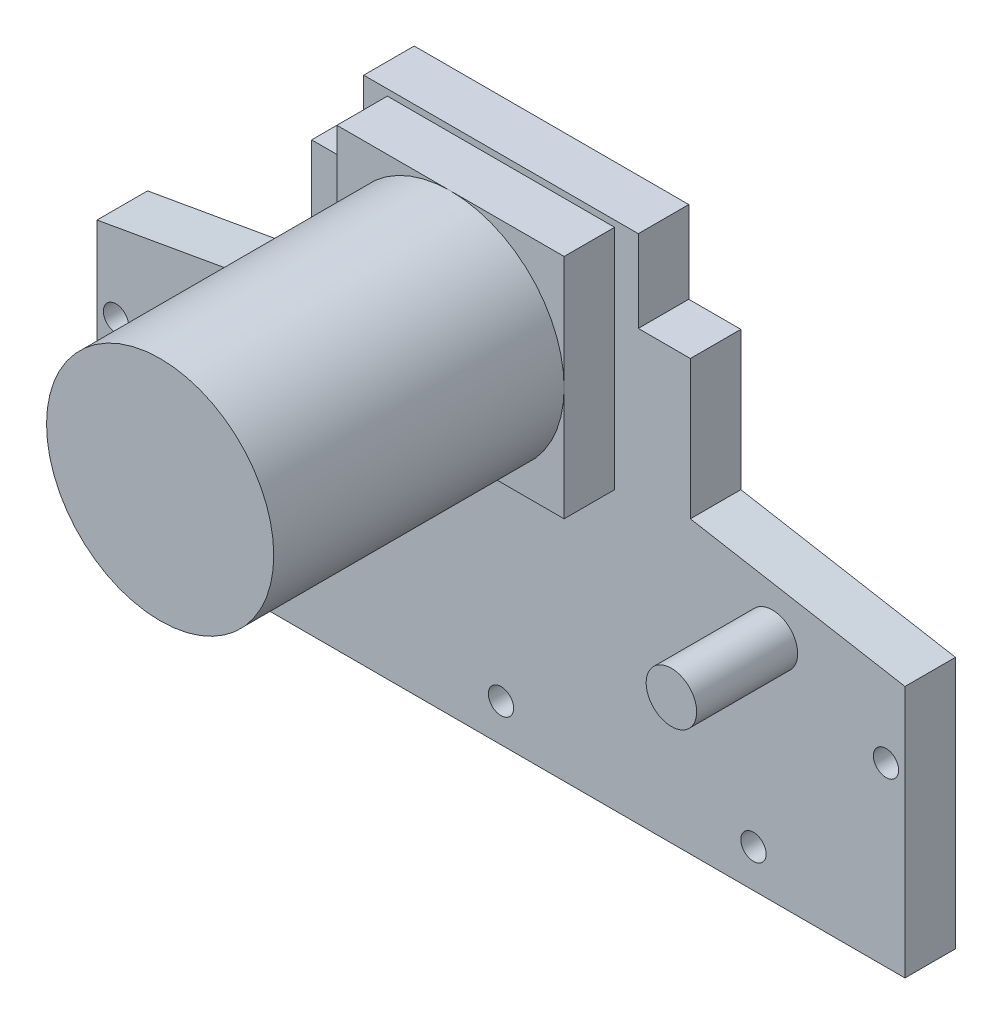
ISO-10303-21;
HEADER;
FILE_DESCRIPTION(('STEP AP214'),'2;1');
FILE_NAME('part.step','',(''),(''),'','','');
FILE_SCHEMA(('AUTOMOTIVE_DESIGN { 1 0 10303 214 1 1 1 1 }'));
ENDSEC;
DATA;
#1=APPLICATION_CONTEXT('core data for automotive mechanical design processes');
#2=APPLICATION_PROTOCOL_DEFINITION('international standard','automotive_design',2000,#1);
#3=PRODUCT_CONTEXT('',#1,'mechanical');
#4=PRODUCT('Part','Part','',(#3));
#5=PRODUCT_RELATED_PRODUCT_CATEGORY('part','',(#4));
#6=PRODUCT_DEFINITION_FORMATION('','',#4);
#7=PRODUCT_DEFINITION_CONTEXT('part definition',#1,'design');
#8=PRODUCT_DEFINITION('design','',#6,#7);
#9=PRODUCT_DEFINITION_SHAPE('','',#8);
#10=(LENGTH_UNIT() NAMED_UNIT(*) SI_UNIT(.MILLI.,.METRE.));
#11=(NAMED_UNIT(*) PLANE_ANGLE_UNIT() SI_UNIT($,.RADIAN.));
#12=(NAMED_UNIT(*) SI_UNIT($,.STERADIAN.) SOLID_ANGLE_UNIT());
#13=UNCERTAINTY_MEASURE_WITH_UNIT(LENGTH_MEASURE(1.E-05),#10,'distance_accuracy_value','');
#14=(GEOMETRIC_REPRESENTATION_CONTEXT(3) GLOBAL_UNCERTAINTY_ASSIGNED_CONTEXT((#13)) GLOBAL_UNIT_ASSIGNED_CONTEXT((#10,
#11,#12)) REPRESENTATION_CONTEXT('',''));
#15=CARTESIAN_POINT('',(0.,0.,0.));
#16=DIRECTION('',(0.,0.,1.));
#17=DIRECTION('',(1.,0.,0.));
#18=AXIS2_PLACEMENT_3D('',#15,#16,#17);
#19=CARTESIAN_POINT('',(0.,-43.1698837667497,4.));
#20=DIRECTION('',(0.,0.,1.));
#21=DIRECTION('',(1.,0.,0.));
#22=AXIS2_PLACEMENT_3D('',#19,#20,#21);
#23=PLANE('',#22);
#24=CARTESIAN_POINT('',(21.5,18.,4.));
#25=DIRECTION('',(0.,0.,1.));
#26=DIRECTION('',(1.,0.,0.));
#27=AXIS2_PLACEMENT_3D('',#24,#25,#26);
#28=CIRCLE('',#27,2.);
#29=CARTESIAN_POINT('',(23.5,18.,4.));
#30=VERTEX_POINT('',#29);
#31=EDGE_CURVE('E217',#30,#30,#28,.T.);
#32=ORIENTED_EDGE('',*,*,#31,.F.);
#33=EDGE_LOOP('',(#32));
#34=FACE_BOUND('',#33,.T.);
#35=CARTESIAN_POINT('',(30.5,14.,4.));
#36=DIRECTION('',(0.,0.,-1.));
#37=DIRECTION('',(-1.,0.,0.));
#38=AXIS2_PLACEMENT_3D('',#35,#36,#37);
#39=CIRCLE('',#38,1.);
#40=CARTESIAN_POINT('',(29.5,14.,4.));
#41=VERTEX_POINT('',#40);
#42=EDGE_CURVE('E260',#41,#41,#39,.T.);
#43=ORIENTED_EDGE('',*,*,#42,.T.);
#44=EDGE_LOOP('',(#43));
#45=FACE_BOUND('',#44,.T.);
#46=CARTESIAN_POINT('',(0.,3.,4.));
#47=DIRECTION('',(0.,0.,1.));
#48=DIRECTION('',(1.,0.,0.));
#49=AXIS2_PLACEMENT_3D('',#46,#47,#48);
#50=CIRCLE('',#49,1.);
#51=CARTESIAN_POINT('',(1.,3.,4.));
#52=VERTEX_POINT('',#51);
#53=EDGE_CURVE('E264',#52,#52,#50,.T.);
#54=ORIENTED_EDGE('',*,*,#53,.F.);
#55=EDGE_LOOP('',(#54));
#56=FACE_BOUND('',#55,.T.);
#57=CARTESIAN_POINT('',(-20.,3.,4.));
#58=DIRECTION('',(0.,0.,1.));
#59=DIRECTION('',(1.,0.,0.));
#60=AXIS2_PLACEMENT_3D('',#57,#58,#59);
#61=CIRCLE('',#60,1.);
#62=CARTESIAN_POINT('',(-19.,3.,4.));
#63=VERTEX_POINT('',#62);
#64=EDGE_CURVE('E268',#63,#63,#61,.T.);
#65=ORIENTED_EDGE('',*,*,#64,.F.);
#66=EDGE_LOOP('',(#65));
#67=FACE_BOUND('',#66,.T.);
#68=CARTESIAN_POINT('',(20.,3.,4.));
#69=DIRECTION('',(0.,0.,1.));
#70=DIRECTION('',(1.,0.,0.));
#71=AXIS2_PLACEMENT_3D('',#68,#69,#70);
#72=CIRCLE('',#71,1.);
#73=CARTESIAN_POINT('',(21.,3.,4.));
#74=VERTEX_POINT('',#73);
#75=EDGE_CURVE('E272',#74,#74,#72,.T.);
#76=ORIENTED_EDGE('',*,*,#75,.F.);
#77=EDGE_LOOP('',(#76));
#78=FACE_BOUND('',#77,.T.);
#79=CARTESIAN_POINT('',(-30.5,14.,4.));
#80=DIRECTION('',(0.,0.,1.));
#81=DIRECTION('',(1.,0.,0.));
#82=AXIS2_PLACEMENT_3D('',#79,#80,#81);
#83=CIRCLE('',#82,1.);
#84=CARTESIAN_POINT('',(-29.5,14.,4.));
#85=VERTEX_POINT('',#84);
#86=EDGE_CURVE('E276',#85,#85,#83,.T.);
#87=ORIENTED_EDGE('',*,*,#86,.F.);
#88=EDGE_LOOP('',(#87));
#89=FACE_BOUND('',#88,.T.);
#90=DIRECTION('',(0.,1.,0.));
#91=VECTOR('',#90,1.);
#92=CARTESIAN_POINT('',(32.,-43.1698837667497,4.));
#93=LINE('',#92,#91);
#94=CARTESIAN_POINT('',(32.,0.,4.));
#95=VERTEX_POINT('',#94);
#96=CARTESIAN_POINT('',(32.,20.,4.));
#97=VERTEX_POINT('',#96);
#98=EDGE_CURVE('E280',#95,#97,#93,.T.);
#99=ORIENTED_EDGE('',*,*,#98,.T.);
#100=DIRECTION('',(-0.984783558817937,0.173785333909048,0.));
#101=VECTOR('',#100,1.);
#102=CARTESIAN_POINT('',(11.7773962151149,23.568694785568,4.));
#103=LINE('',#102,#101);
#104=CARTESIAN_POINT('',(15.,23.,4.));
#105=VERTEX_POINT('',#104);
#106=EDGE_CURVE('E283',#97,#105,#103,.T.);
#107=ORIENTED_EDGE('',*,*,#106,.T.);
#108=DIRECTION('',(0.,-1.,0.));
#109=VECTOR('',#108,1.);
#110=CARTESIAN_POINT('',(15.,-43.1698837667497,4.));
#111=LINE('',#110,#109);
#112=CARTESIAN_POINT('',(15.,34.,4.));
#113=VERTEX_POINT('',#112);
#114=EDGE_CURVE('E286',#113,#105,#111,.T.);
#115=ORIENTED_EDGE('',*,*,#114,.F.);
#116=DIRECTION('',(1.,0.,0.));
#117=VECTOR('',#116,1.);
#118=CARTESIAN_POINT('',(0.,34.,4.));
#119=LINE('',#118,#117);
#120=CARTESIAN_POINT('',(10.875,34.,4.));
#121=VERTEX_POINT('',#120);
#122=EDGE_CURVE('E289',#121,#113,#119,.T.);
#123=ORIENTED_EDGE('',*,*,#122,.F.);
#124=DIRECTION('',(0.,-1.,0.));
#125=VECTOR('',#124,1.);
#126=CARTESIAN_POINT('',(10.875,-43.1698837667497,4.));
#127=LINE('',#126,#125);
#128=CARTESIAN_POINT('',(10.875,40.5,4.));
#129=VERTEX_POINT('',#128);
#130=EDGE_CURVE('E292',#129,#121,#127,.T.);
#131=ORIENTED_EDGE('',*,*,#130,.F.);
#132=DIRECTION('',(1.,0.,0.));
#133=VECTOR('',#132,1.);
#134=CARTESIAN_POINT('',(0.,40.5,4.));
#135=LINE('',#134,#133);
#136=CARTESIAN_POINT('',(-10.875,40.5,4.));
#137=VERTEX_POINT('',#136);
#138=EDGE_CURVE('E296',#137,#129,#135,.T.);
#139=ORIENTED_EDGE('',*,*,#138,.F.);
#140=DIRECTION('',(0.,-1.,0.));
#141=VECTOR('',#140,1.);
#142=CARTESIAN_POINT('',(-10.875,-43.1698837667497,4.));
#143=LINE('',#142,#141);
#144=CARTESIAN_POINT('',(-10.875,34.,4.));
#145=VERTEX_POINT('',#144);
#146=EDGE_CURVE('E299',#137,#145,#143,.T.);
#147=ORIENTED_EDGE('',*,*,#146,.T.);
#148=CARTESIAN_POINT('',(-15.,34.,4.));
#149=VERTEX_POINT('',#148);
#150=EDGE_CURVE('E293',#149,#145,#119,.T.);
#151=ORIENTED_EDGE('',*,*,#150,.F.);
#152=DIRECTION('',(0.,1.,0.));
#153=VECTOR('',#152,1.);
#154=CARTESIAN_POINT('',(-15.,-43.1698837667497,4.));
#155=LINE('',#154,#153);
#156=CARTESIAN_POINT('',(-15.,23.,4.));
#157=VERTEX_POINT('',#156);
#158=EDGE_CURVE('E301',#157,#149,#155,.T.);
#159=ORIENTED_EDGE('',*,*,#158,.F.);
#160=DIRECTION('',(0.984783558817937,0.173785333909048,0.));
#161=VECTOR('',#160,1.);
#162=CARTESIAN_POINT('',(-11.7773962151149,23.568694785568,4.));
#163=LINE('',#162,#161);
#164=CARTESIAN_POINT('',(-32.,20.,4.));
#165=VERTEX_POINT('',#164);
#166=EDGE_CURVE('E304',#165,#157,#163,.T.);
#167=ORIENTED_EDGE('',*,*,#166,.F.);
#168=DIRECTION('',(0.,1.,0.));
#169=VECTOR('',#168,1.);
#170=CARTESIAN_POINT('',(-32.,-43.1698837667497,4.));
#171=LINE('',#170,#169);
#172=CARTESIAN_POINT('',(-32.,0.,4.));
#173=VERTEX_POINT('',#172);
#174=EDGE_CURVE('E307',#173,#165,#171,.T.);
#175=ORIENTED_EDGE('',*,*,#174,.F.);
#176=DIRECTION('',(1.,0.,0.));
#177=VECTOR('',#176,1.);
#178=CARTESIAN_POINT('',(0.,0.,4.));
#179=LINE('',#178,#177);
#180=EDGE_CURVE('E310',#173,#95,#179,.T.);
#181=ORIENTED_EDGE('',*,*,#180,.T.);
#182=EDGE_LOOP('',(#99,#107,#115,#123,#131,#139,#147,#151,#159,#167,#175,#181));
#183=FACE_BOUND('',#182,.T.);
#184=CARTESIAN_POINT('',(-21.5,18.,4.));
#185=DIRECTION('',(0.,0.,1.));
#186=DIRECTION('',(1.,0.,0.));
#187=AXIS2_PLACEMENT_3D('',#184,#185,#186);
#188=CIRCLE('',#187,2.);
#189=CARTESIAN_POINT('',(-19.5,18.,4.));
#190=VERTEX_POINT('',#189);
#191=EDGE_CURVE('E205',#190,#190,#188,.T.);
#192=ORIENTED_EDGE('',*,*,#191,.F.);
#193=EDGE_LOOP('',(#192));
#194=FACE_BOUND('',#193,.T.);
#195=DIRECTION('',(0.,-1.,0.));
#196=VECTOR('',#195,1.);
#197=CARTESIAN_POINT('',(-8.99999999999974,40.0000000000001,4.));
#198=LINE('',#197,#196);
#199=CARTESIAN_POINT('',(-8.99999999999974,40.0000000000001,4.));
#200=VERTEX_POINT('',#199);
#201=CARTESIAN_POINT('',(-8.99999999999974,22.0000000000001,4.));
#202=VERTEX_POINT('',#201);
#203=EDGE_CURVE('E771',#200,#202,#198,.T.);
#204=ORIENTED_EDGE('',*,*,#203,.F.);
#205=DIRECTION('',(-1.,0.,0.));
#206=VECTOR('',#205,1.);
#207=CARTESIAN_POINT('',(-8.99999999999974,40.0000000000001,4.));
#208=LINE('',#207,#206);
#209=CARTESIAN_POINT('',(9.00000000000026,40.0000000000001,4.));
#210=VERTEX_POINT('',#209);
#211=EDGE_CURVE('E769',#210,#200,#208,.T.);
#212=ORIENTED_EDGE('',*,*,#211,.F.);
#213=DIRECTION('',(0.,1.,0.));
#214=VECTOR('',#213,1.);
#215=CARTESIAN_POINT('',(9.00000000000026,40.0000000000001,4.));
#216=LINE('',#215,#214);
#217=CARTESIAN_POINT('',(9.00000000000026,22.0000000000001,4.));
#218=VERTEX_POINT('',#217);
#219=EDGE_CURVE('E204',#218,#210,#216,.T.);
#220=ORIENTED_EDGE('',*,*,#219,.F.);
#221=DIRECTION('',(1.,0.,0.));
#222=VECTOR('',#221,1.);
#223=CARTESIAN_POINT('',(-8.99999999999974,22.0000000000001,4.));
#224=LINE('',#223,#222);
#225=EDGE_CURVE('E49',#202,#218,#224,.T.);
#226=ORIENTED_EDGE('',*,*,#225,.F.);
#227=EDGE_LOOP('',(#204,#212,#220,#226));
#228=FACE_BOUND('',#227,.T.);
#229=ADVANCED_FACE('F33',(#34,#45,#56,#67,#78,#89,#183,#194,#228),#23,.T.);
#230=CARTESIAN_POINT('',(0.,-43.1698837667497,0.));
#231=DIRECTION('',(0.,0.,1.));
#232=DIRECTION('',(1.,0.,0.));
#233=AXIS2_PLACEMENT_3D('',#230,#231,#232);
#234=PLANE('',#233);
#235=CARTESIAN_POINT('',(30.5,14.,0.));
#236=DIRECTION('',(0.,0.,1.));
#237=DIRECTION('',(1.,0.,0.));
#238=AXIS2_PLACEMENT_3D('',#235,#236,#237);
#239=CIRCLE('',#238,1.);
#240=CARTESIAN_POINT('',(31.5,14.,0.));
#241=VERTEX_POINT('',#240);
#242=EDGE_CURVE('E263',#241,#241,#239,.F.);
#243=ORIENTED_EDGE('',*,*,#242,.F.);
#244=EDGE_LOOP('',(#243));
#245=FACE_BOUND('',#244,.T.);
#246=CARTESIAN_POINT('',(0.,3.,0.));
#247=DIRECTION('',(0.,0.,1.));
#248=DIRECTION('',(1.,0.,0.));
#249=AXIS2_PLACEMENT_3D('',#246,#247,#248);
#250=CIRCLE('',#249,1.);
#251=CARTESIAN_POINT('',(1.,3.,0.));
#252=VERTEX_POINT('',#251);
#253=EDGE_CURVE('E267',#252,#252,#250,.T.);
#254=ORIENTED_EDGE('',*,*,#253,.T.);
#255=EDGE_LOOP('',(#254));
#256=FACE_BOUND('',#255,.T.);
#257=CARTESIAN_POINT('',(-20.,3.,0.));
#258=DIRECTION('',(0.,0.,1.));
#259=DIRECTION('',(1.,0.,0.));
#260=AXIS2_PLACEMENT_3D('',#257,#258,#259);
#261=CIRCLE('',#260,1.);
#262=CARTESIAN_POINT('',(-19.,3.,0.));
#263=VERTEX_POINT('',#262);
#264=EDGE_CURVE('E271',#263,#263,#261,.T.);
#265=ORIENTED_EDGE('',*,*,#264,.T.);
#266=EDGE_LOOP('',(#265));
#267=FACE_BOUND('',#266,.T.);
#268=CARTESIAN_POINT('',(20.,3.,0.));
#269=DIRECTION('',(0.,0.,1.));
#270=DIRECTION('',(1.,0.,0.));
#271=AXIS2_PLACEMENT_3D('',#268,#269,#270);
#272=CIRCLE('',#271,1.);
#273=CARTESIAN_POINT('',(21.,3.,0.));
#274=VERTEX_POINT('',#273);
#275=EDGE_CURVE('E275',#274,#274,#272,.T.);
#276=ORIENTED_EDGE('',*,*,#275,.T.);
#277=EDGE_LOOP('',(#276));
#278=FACE_BOUND('',#277,.T.);
#279=CARTESIAN_POINT('',(-30.5,14.,0.));
#280=DIRECTION('',(0.,0.,1.));
#281=DIRECTION('',(1.,0.,0.));
#282=AXIS2_PLACEMENT_3D('',#279,#280,#281);
#283=CIRCLE('',#282,1.);
#284=CARTESIAN_POINT('',(-29.5,14.,0.));
#285=VERTEX_POINT('',#284);
#286=EDGE_CURVE('E279',#285,#285,#283,.T.);
#287=ORIENTED_EDGE('',*,*,#286,.T.);
#288=EDGE_LOOP('',(#287));
#289=FACE_BOUND('',#288,.T.);
#290=DIRECTION('',(0.,1.,0.));
#291=VECTOR('',#290,1.);
#292=CARTESIAN_POINT('',(32.,-43.1698837667497,0.));
#293=LINE('',#292,#291);
#294=CARTESIAN_POINT('',(32.,0.,0.));
#295=VERTEX_POINT('',#294);
#296=CARTESIAN_POINT('',(32.,20.,0.));
#297=VERTEX_POINT('',#296);
#298=EDGE_CURVE('E313',#295,#297,#293,.T.);
#299=ORIENTED_EDGE('',*,*,#298,.F.);
#300=DIRECTION('',(1.,0.,0.));
#301=VECTOR('',#300,1.);
#302=CARTESIAN_POINT('',(0.,0.,0.));
#303=LINE('',#302,#301);
#304=CARTESIAN_POINT('',(-32.,0.,0.));
#305=VERTEX_POINT('',#304);
#306=EDGE_CURVE('E284',#305,#295,#303,.T.);
#307=ORIENTED_EDGE('',*,*,#306,.F.);
#308=DIRECTION('',(0.,1.,0.));
#309=VECTOR('',#308,1.);
#310=CARTESIAN_POINT('',(-32.,-43.1698837667497,0.));
#311=LINE('',#310,#309);
#312=CARTESIAN_POINT('',(-32.,20.,0.));
#313=VERTEX_POINT('',#312);
#314=EDGE_CURVE('E341',#305,#313,#311,.T.);
#315=ORIENTED_EDGE('',*,*,#314,.T.);
#316=DIRECTION('',(0.984783558817937,0.173785333909048,0.));
#317=VECTOR('',#316,1.);
#318=CARTESIAN_POINT('',(-11.7773962151149,23.568694785568,0.));
#319=LINE('',#318,#317);
#320=CARTESIAN_POINT('',(-15.,23.,0.));
#321=VERTEX_POINT('',#320);
#322=EDGE_CURVE('E338',#313,#321,#319,.T.);
#323=ORIENTED_EDGE('',*,*,#322,.T.);
#324=DIRECTION('',(0.,1.,0.));
#325=VECTOR('',#324,1.);
#326=CARTESIAN_POINT('',(-15.,-43.1698837667497,0.));
#327=LINE('',#326,#325);
#328=CARTESIAN_POINT('',(-15.,34.,0.));
#329=VERTEX_POINT('',#328);
#330=EDGE_CURVE('E335',#321,#329,#327,.T.);
#331=ORIENTED_EDGE('',*,*,#330,.T.);
#332=DIRECTION('',(1.,0.,0.));
#333=VECTOR('',#332,1.);
#334=CARTESIAN_POINT('',(0.,34.,0.));
#335=LINE('',#334,#333);
#336=CARTESIAN_POINT('',(-10.875,34.,0.));
#337=VERTEX_POINT('',#336);
#338=EDGE_CURVE('E326',#329,#337,#335,.T.);
#339=ORIENTED_EDGE('',*,*,#338,.T.);
#340=DIRECTION('',(0.,-1.,0.));
#341=VECTOR('',#340,1.);
#342=CARTESIAN_POINT('',(-10.875,-43.1698837667497,0.));
#343=LINE('',#342,#341);
#344=CARTESIAN_POINT('',(-10.875,40.5,0.));
#345=VERTEX_POINT('',#344);
#346=EDGE_CURVE('E332',#345,#337,#343,.T.);
#347=ORIENTED_EDGE('',*,*,#346,.F.);
#348=DIRECTION('',(1.,0.,0.));
#349=VECTOR('',#348,1.);
#350=CARTESIAN_POINT('',(0.,40.5,0.));
#351=LINE('',#350,#349);
#352=CARTESIAN_POINT('',(10.875,40.5,0.));
#353=VERTEX_POINT('',#352);
#354=EDGE_CURVE('E329',#345,#353,#351,.T.);
#355=ORIENTED_EDGE('',*,*,#354,.T.);
#356=DIRECTION('',(0.,-1.,0.));
#357=VECTOR('',#356,1.);
#358=CARTESIAN_POINT('',(10.875,-43.1698837667497,0.));
#359=LINE('',#358,#357);
#360=CARTESIAN_POINT('',(10.875,34.,0.));
#361=VERTEX_POINT('',#360);
#362=EDGE_CURVE('E325',#353,#361,#359,.T.);
#363=ORIENTED_EDGE('',*,*,#362,.T.);
#364=CARTESIAN_POINT('',(15.,34.,0.));
#365=VERTEX_POINT('',#364);
#366=EDGE_CURVE('E322',#361,#365,#335,.T.);
#367=ORIENTED_EDGE('',*,*,#366,.T.);
#368=DIRECTION('',(0.,-1.,0.));
#369=VECTOR('',#368,1.);
#370=CARTESIAN_POINT('',(15.,-43.1698837667497,0.));
#371=LINE('',#370,#369);
#372=CARTESIAN_POINT('',(15.,23.,0.));
#373=VERTEX_POINT('',#372);
#374=EDGE_CURVE('E319',#365,#373,#371,.T.);
#375=ORIENTED_EDGE('',*,*,#374,.T.);
#376=DIRECTION('',(-0.984783558817937,0.173785333909048,0.));
#377=VECTOR('',#376,1.);
#378=CARTESIAN_POINT('',(11.7773962151149,23.568694785568,0.));
#379=LINE('',#378,#377);
#380=EDGE_CURVE('E316',#297,#373,#379,.T.);
#381=ORIENTED_EDGE('',*,*,#380,.F.);
#382=EDGE_LOOP('',(#299,#307,#315,#323,#331,#339,#347,#355,#363,#367,#375,#381));
#383=FACE_BOUND('',#382,.T.);
#384=DIRECTION('',(0.,-1.,0.));
#385=VECTOR('',#384,1.);
#386=CARTESIAN_POINT('',(5.,10.,0.));
#387=LINE('',#386,#385);
#388=CARTESIAN_POINT('',(5.,28.,0.));
#389=VERTEX_POINT('',#388);
#390=CARTESIAN_POINT('',(5.,10.,0.));
#391=VERTEX_POINT('',#390);
#392=EDGE_CURVE('E222',#389,#391,#387,.T.);
#393=ORIENTED_EDGE('',*,*,#392,.F.);
#394=DIRECTION('',(1.,0.,0.));
#395=VECTOR('',#394,1.);
#396=CARTESIAN_POINT('',(5.,28.,0.));
#397=LINE('',#396,#395);
#398=CARTESIAN_POINT('',(-13.,28.,0.));
#399=VERTEX_POINT('',#398);
#400=EDGE_CURVE('E229',#399,#389,#397,.T.);
#401=ORIENTED_EDGE('',*,*,#400,.F.);
#402=DIRECTION('',(0.,1.,0.));
#403=VECTOR('',#402,1.);
#404=CARTESIAN_POINT('',(-13.,10.,0.));
#405=LINE('',#404,#403);
#406=CARTESIAN_POINT('',(-13.,10.,0.));
#407=VERTEX_POINT('',#406);
#408=EDGE_CURVE('E241',#407,#399,#405,.T.);
#409=ORIENTED_EDGE('',*,*,#408,.F.);
#410=DIRECTION('',(-1.,0.,0.));
#411=VECTOR('',#410,1.);
#412=CARTESIAN_POINT('',(5.,10.,0.));
#413=LINE('',#412,#411);
#414=EDGE_CURVE('E238',#391,#407,#413,.T.);
#415=ORIENTED_EDGE('',*,*,#414,.F.);
#416=EDGE_LOOP('',(#393,#401,#409,#415));
#417=FACE_BOUND('',#416,.T.);
#418=ADVANCED_FACE('F382',(#245,#256,#267,#278,#289,#383,#417),#234,.F.);
#419=CARTESIAN_POINT('',(32.,-43.1698837667497,4.));
#420=DIRECTION('',(-1.,0.,0.));
#421=DIRECTION('',(0.,0.,1.));
#422=AXIS2_PLACEMENT_3D('',#419,#420,#421);
#423=PLANE('',#422);
#424=ORIENTED_EDGE('',*,*,#298,.T.);
#425=DIRECTION('',(0.,0.,-1.));
#426=VECTOR('',#425,1.);
#427=CARTESIAN_POINT('',(32.,20.,4.));
#428=LINE('',#427,#426);
#429=EDGE_CURVE('E367',#97,#297,#428,.T.);
#430=ORIENTED_EDGE('',*,*,#429,.F.);
#431=ORIENTED_EDGE('',*,*,#98,.F.);
#432=DIRECTION('',(0.,0.,-1.));
#433=VECTOR('',#432,1.);
#434=CARTESIAN_POINT('',(32.,0.,4.));
#435=LINE('',#434,#433);
#436=EDGE_CURVE('E312',#95,#295,#435,.T.);
#437=ORIENTED_EDGE('',*,*,#436,.T.);
#438=EDGE_LOOP('',(#424,#430,#431,#437));
#439=FACE_BOUND('',#438,.T.);
#440=ADVANCED_FACE('F35',(#439),#423,.F.);
#441=CARTESIAN_POINT('',(11.7773962151149,23.568694785568,4.));
#442=DIRECTION('',(-0.173785333909048,-0.984783558817937,0.));
#443=DIRECTION('',(0.984783558817937,-0.173785333909048,0.));
#444=AXIS2_PLACEMENT_3D('',#441,#442,#443);
#445=PLANE('',#444);
#446=ORIENTED_EDGE('',*,*,#380,.T.);
#447=DIRECTION('',(0.,0.,-1.));
#448=VECTOR('',#447,1.);
#449=CARTESIAN_POINT('',(15.,23.,4.));
#450=LINE('',#449,#448);
#451=EDGE_CURVE('E365',#105,#373,#450,.T.);
#452=ORIENTED_EDGE('',*,*,#451,.F.);
#453=ORIENTED_EDGE('',*,*,#106,.F.);
#454=ORIENTED_EDGE('',*,*,#429,.T.);
#455=EDGE_LOOP('',(#446,#452,#453,#454));
#456=FACE_BOUND('',#455,.T.);
#457=ADVANCED_FACE('F470',(#456),#445,.F.);
#458=CARTESIAN_POINT('',(15.,-43.1698837667497,4.));
#459=DIRECTION('',(1.,0.,0.));
#460=DIRECTION('',(0.,0.,-1.));
#461=AXIS2_PLACEMENT_3D('',#458,#459,#460);
#462=PLANE('',#461);
#463=ORIENTED_EDGE('',*,*,#374,.F.);
#464=DIRECTION('',(0.,0.,-1.));
#465=VECTOR('',#464,1.);
#466=CARTESIAN_POINT('',(15.,34.,4.));
#467=LINE('',#466,#465);
#468=EDGE_CURVE('E363',#113,#365,#467,.T.);
#469=ORIENTED_EDGE('',*,*,#468,.F.);
#470=ORIENTED_EDGE('',*,*,#114,.T.);
#471=ORIENTED_EDGE('',*,*,#451,.T.);
#472=EDGE_LOOP('',(#463,#469,#470,#471));
#473=FACE_BOUND('',#472,.T.);
#474=ADVANCED_FACE('F468',(#473),#462,.T.);
#475=CARTESIAN_POINT('',(0.,34.,4.));
#476=DIRECTION('',(0.,1.,0.));
#477=DIRECTION('',(0.,0.,1.));
#478=AXIS2_PLACEMENT_3D('',#475,#476,#477);
#479=PLANE('',#478);
#480=ORIENTED_EDGE('',*,*,#366,.F.);
#481=DIRECTION('',(0.,0.,-1.));
#482=VECTOR('',#481,1.);
#483=CARTESIAN_POINT('',(10.875,34.,4.));
#484=LINE('',#483,#482);
#485=EDGE_CURVE('E361',#121,#361,#484,.T.);
#486=ORIENTED_EDGE('',*,*,#485,.F.);
#487=ORIENTED_EDGE('',*,*,#122,.T.);
#488=ORIENTED_EDGE('',*,*,#468,.T.);
#489=EDGE_LOOP('',(#480,#486,#487,#488));
#490=FACE_BOUND('',#489,.T.);
#491=ADVANCED_FACE('F456',(#490),#479,.T.);
#492=CARTESIAN_POINT('',(10.875,-43.1698837667497,4.));
#493=DIRECTION('',(1.,0.,0.));
#494=DIRECTION('',(0.,0.,-1.));
#495=AXIS2_PLACEMENT_3D('',#492,#493,#494);
#496=PLANE('',#495);
#497=ORIENTED_EDGE('',*,*,#362,.F.);
#498=DIRECTION('',(0.,0.,-1.));
#499=VECTOR('',#498,1.);
#500=CARTESIAN_POINT('',(10.875,40.5,4.));
#501=LINE('',#500,#499);
#502=EDGE_CURVE('E359',#129,#353,#501,.T.);
#503=ORIENTED_EDGE('',*,*,#502,.F.);
#504=ORIENTED_EDGE('',*,*,#130,.T.);
#505=ORIENTED_EDGE('',*,*,#485,.T.);
#506=EDGE_LOOP('',(#497,#503,#504,#505));
#507=FACE_BOUND('',#506,.T.);
#508=ADVANCED_FACE('F463',(#507),#496,.T.);
#509=CARTESIAN_POINT('',(0.,40.5,4.));
#510=DIRECTION('',(0.,1.,0.));
#511=DIRECTION('',(0.,0.,1.));
#512=AXIS2_PLACEMENT_3D('',#509,#510,#511);
#513=PLANE('',#512);
#514=ORIENTED_EDGE('',*,*,#354,.F.);
#515=DIRECTION('',(0.,0.,-1.));
#516=VECTOR('',#515,1.);
#517=CARTESIAN_POINT('',(-10.875,40.5,4.));
#518=LINE('',#517,#516);
#519=EDGE_CURVE('E357',#137,#345,#518,.T.);
#520=ORIENTED_EDGE('',*,*,#519,.F.);
#521=ORIENTED_EDGE('',*,*,#138,.T.);
#522=ORIENTED_EDGE('',*,*,#502,.T.);
#523=EDGE_LOOP('',(#514,#520,#521,#522));
#524=FACE_BOUND('',#523,.T.);
#525=ADVANCED_FACE('F459',(#524),#513,.T.);
#526=CARTESIAN_POINT('',(-10.875,-43.1698837667497,4.));
#527=DIRECTION('',(1.,0.,0.));
#528=DIRECTION('',(0.,0.,-1.));
#529=AXIS2_PLACEMENT_3D('',#526,#527,#528);
#530=PLANE('',#529);
#531=ORIENTED_EDGE('',*,*,#346,.T.);
#532=DIRECTION('',(0.,0.,-1.));
#533=VECTOR('',#532,1.);
#534=CARTESIAN_POINT('',(-10.875,34.,4.));
#535=LINE('',#534,#533);
#536=EDGE_CURVE('E355',#145,#337,#535,.T.);
#537=ORIENTED_EDGE('',*,*,#536,.F.);
#538=ORIENTED_EDGE('',*,*,#146,.F.);
#539=ORIENTED_EDGE('',*,*,#519,.T.);
#540=EDGE_LOOP('',(#531,#537,#538,#539));
#541=FACE_BOUND('',#540,.T.);
#542=ADVANCED_FACE('F454',(#541),#530,.F.);
#543=ORIENTED_EDGE('',*,*,#338,.F.);
#544=DIRECTION('',(0.,0.,-1.));
#545=VECTOR('',#544,1.);
#546=CARTESIAN_POINT('',(-15.,34.,4.));
#547=LINE('',#546,#545);
#548=EDGE_CURVE('E353',#149,#329,#547,.T.);
#549=ORIENTED_EDGE('',*,*,#548,.F.);
#550=ORIENTED_EDGE('',*,*,#150,.T.);
#551=ORIENTED_EDGE('',*,*,#536,.T.);
#552=EDGE_LOOP('',(#543,#549,#550,#551));
#553=FACE_BOUND('',#552,.T.);
#554=ADVANCED_FACE('F450',(#553),#479,.T.);
#555=CARTESIAN_POINT('',(-15.,-43.1698837667497,4.));
#556=DIRECTION('',(-1.,0.,0.));
#557=DIRECTION('',(0.,0.,1.));
#558=AXIS2_PLACEMENT_3D('',#555,#556,#557);
#559=PLANE('',#558);
#560=ORIENTED_EDGE('',*,*,#330,.F.);
#561=DIRECTION('',(0.,0.,-1.));
#562=VECTOR('',#561,1.);
#563=CARTESIAN_POINT('',(-15.,23.,4.));
#564=LINE('',#563,#562);
#565=EDGE_CURVE('E351',#157,#321,#564,.T.);
#566=ORIENTED_EDGE('',*,*,#565,.F.);
#567=ORIENTED_EDGE('',*,*,#158,.T.);
#568=ORIENTED_EDGE('',*,*,#548,.T.);
#569=EDGE_LOOP('',(#560,#566,#567,#568));
#570=FACE_BOUND('',#569,.T.);
#571=ADVANCED_FACE('F446',(#570),#559,.T.);
#572=CARTESIAN_POINT('',(-11.7773962151149,23.568694785568,4.));
#573=DIRECTION('',(-0.173785333909048,0.984783558817937,0.));
#574=DIRECTION('',(-0.984783558817937,-0.173785333909048,0.));
#575=AXIS2_PLACEMENT_3D('',#572,#573,#574);
#576=PLANE('',#575);
#577=ORIENTED_EDGE('',*,*,#322,.F.);
#578=DIRECTION('',(0.,0.,-1.));
#579=VECTOR('',#578,1.);
#580=CARTESIAN_POINT('',(-32.,20.,4.));
#581=LINE('',#580,#579);
#582=EDGE_CURVE('E349',#165,#313,#581,.T.);
#583=ORIENTED_EDGE('',*,*,#582,.F.);
#584=ORIENTED_EDGE('',*,*,#166,.T.);
#585=ORIENTED_EDGE('',*,*,#565,.T.);
#586=EDGE_LOOP('',(#577,#583,#584,#585));
#587=FACE_BOUND('',#586,.T.);
#588=ADVANCED_FACE('F442',(#587),#576,.T.);
#589=CARTESIAN_POINT('',(-32.,-43.1698837667497,4.));
#590=DIRECTION('',(-1.,0.,0.));
#591=DIRECTION('',(0.,0.,1.));
#592=AXIS2_PLACEMENT_3D('',#589,#590,#591);
#593=PLANE('',#592);
#594=ORIENTED_EDGE('',*,*,#314,.F.);
#595=DIRECTION('',(0.,0.,-1.));
#596=VECTOR('',#595,1.);
#597=CARTESIAN_POINT('',(-32.,0.,4.));
#598=LINE('',#597,#596);
#599=EDGE_CURVE('E347',#173,#305,#598,.T.);
#600=ORIENTED_EDGE('',*,*,#599,.F.);
#601=ORIENTED_EDGE('',*,*,#174,.T.);
#602=ORIENTED_EDGE('',*,*,#582,.T.);
#603=EDGE_LOOP('',(#594,#600,#601,#602));
#604=FACE_BOUND('',#603,.T.);
#605=ADVANCED_FACE('F438',(#604),#593,.T.);
#606=CARTESIAN_POINT('',(0.,0.,4.));
#607=DIRECTION('',(0.,1.,0.));
#608=DIRECTION('',(0.,0.,1.));
#609=AXIS2_PLACEMENT_3D('',#606,#607,#608);
#610=PLANE('',#609);
#611=ORIENTED_EDGE('',*,*,#306,.T.);
#612=ORIENTED_EDGE('',*,*,#436,.F.);
#613=ORIENTED_EDGE('',*,*,#180,.F.);
#614=ORIENTED_EDGE('',*,*,#599,.T.);
#615=EDGE_LOOP('',(#611,#612,#613,#614));
#616=FACE_BOUND('',#615,.T.);
#617=ADVANCED_FACE('F435',(#616),#610,.F.);
#618=CARTESIAN_POINT('',(-30.5,14.,-1.));
#619=DIRECTION('',(0.,0.,1.));
#620=DIRECTION('',(1.,0.,0.));
#621=AXIS2_PLACEMENT_3D('',#618,#619,#620);
#622=CYLINDRICAL_SURFACE('',#621,1.);
#623=ORIENTED_EDGE('',*,*,#86,.T.);
#624=EDGE_LOOP('',(#623));
#625=FACE_BOUND('',#624,.T.);
#626=ORIENTED_EDGE('',*,*,#286,.F.);
#627=EDGE_LOOP('',(#626));
#628=FACE_BOUND('',#627,.T.);
#629=ADVANCED_FACE('F432',(#625,#628),#622,.F.);
#630=CARTESIAN_POINT('',(20.,3.,-1.));
#631=DIRECTION('',(0.,0.,1.));
#632=DIRECTION('',(1.,0.,0.));
#633=AXIS2_PLACEMENT_3D('',#630,#631,#632);
#634=CYLINDRICAL_SURFACE('',#633,1.);
#635=ORIENTED_EDGE('',*,*,#75,.T.);
#636=EDGE_LOOP('',(#635));
#637=FACE_BOUND('',#636,.T.);
#638=ORIENTED_EDGE('',*,*,#275,.F.);
#639=EDGE_LOOP('',(#638));
#640=FACE_BOUND('',#639,.T.);
#641=ADVANCED_FACE('F550',(#637,#640),#634,.F.);
#642=CARTESIAN_POINT('',(-20.,3.,-1.));
#643=DIRECTION('',(0.,0.,1.));
#644=DIRECTION('',(1.,0.,0.));
#645=AXIS2_PLACEMENT_3D('',#642,#643,#644);
#646=CYLINDRICAL_SURFACE('',#645,1.);
#647=ORIENTED_EDGE('',*,*,#64,.T.);
#648=EDGE_LOOP('',(#647));
#649=FACE_BOUND('',#648,.T.);
#650=ORIENTED_EDGE('',*,*,#264,.F.);
#651=EDGE_LOOP('',(#650));
#652=FACE_BOUND('',#651,.T.);
#653=ADVANCED_FACE('F557',(#649,#652),#646,.F.);
#654=CARTESIAN_POINT('',(0.,3.,-1.));
#655=DIRECTION('',(0.,0.,1.));
#656=DIRECTION('',(1.,0.,0.));
#657=AXIS2_PLACEMENT_3D('',#654,#655,#656);
#658=CYLINDRICAL_SURFACE('',#657,1.);
#659=ORIENTED_EDGE('',*,*,#53,.T.);
#660=EDGE_LOOP('',(#659));
#661=FACE_BOUND('',#660,.T.);
#662=ORIENTED_EDGE('',*,*,#253,.F.);
#663=EDGE_LOOP('',(#662));
#664=FACE_BOUND('',#663,.T.);
#665=ADVANCED_FACE('F564',(#661,#664),#658,.F.);
#666=CARTESIAN_POINT('',(30.5,14.,-1.));
#667=DIRECTION('',(0.,0.,1.));
#668=DIRECTION('',(1.,0.,0.));
#669=AXIS2_PLACEMENT_3D('',#666,#667,#668);
#670=CYLINDRICAL_SURFACE('',#669,1.);
#671=ORIENTED_EDGE('',*,*,#42,.F.);
#672=EDGE_LOOP('',(#671));
#673=FACE_BOUND('',#672,.T.);
#674=ORIENTED_EDGE('',*,*,#242,.T.);
#675=EDGE_LOOP('',(#674));
#676=FACE_BOUND('',#675,.T.);
#677=ADVANCED_FACE('F380',(#673,#676),#670,.F.);
#678=CARTESIAN_POINT('',(5.,10.,-3.));
#679=DIRECTION('',(-1.,0.,0.));
#680=DIRECTION('',(0.,0.,1.));
#681=AXIS2_PLACEMENT_3D('',#678,#679,#680);
#682=PLANE('',#681);
#683=ORIENTED_EDGE('',*,*,#392,.T.);
#684=DIRECTION('',(0.,0.,1.));
#685=VECTOR('',#684,1.);
#686=CARTESIAN_POINT('',(5.,10.,-3.));
#687=LINE('',#686,#685);
#688=CARTESIAN_POINT('',(5.,10.,-3.));
#689=VERTEX_POINT('',#688);
#690=EDGE_CURVE('E254',#689,#391,#687,.T.);
#691=ORIENTED_EDGE('',*,*,#690,.F.);
#692=DIRECTION('',(0.,-1.,0.));
#693=VECTOR('',#692,1.);
#694=CARTESIAN_POINT('',(5.,10.,-3.));
#695=LINE('',#694,#693);
#696=CARTESIAN_POINT('',(5.,28.,-3.));
#697=VERTEX_POINT('',#696);
#698=EDGE_CURVE('E225',#697,#689,#695,.T.);
#699=ORIENTED_EDGE('',*,*,#698,.F.);
#700=DIRECTION('',(0.,0.,1.));
#701=VECTOR('',#700,1.);
#702=CARTESIAN_POINT('',(5.,28.,-3.));
#703=LINE('',#702,#701);
#704=EDGE_CURVE('E235',#697,#389,#703,.T.);
#705=ORIENTED_EDGE('',*,*,#704,.T.);
#706=EDGE_LOOP('',(#683,#691,#699,#705));
#707=FACE_BOUND('',#706,.T.);
#708=ADVANCED_FACE('F405',(#707),#682,.F.);
#709=CARTESIAN_POINT('',(5.,10.,-3.));
#710=DIRECTION('',(0.,1.,0.));
#711=DIRECTION('',(0.,0.,1.));
#712=AXIS2_PLACEMENT_3D('',#709,#710,#711);
#713=PLANE('',#712);
#714=ORIENTED_EDGE('',*,*,#414,.T.);
#715=DIRECTION('',(0.,0.,1.));
#716=VECTOR('',#715,1.);
#717=CARTESIAN_POINT('',(-13.,10.,-3.));
#718=LINE('',#717,#716);
#719=CARTESIAN_POINT('',(-13.,10.,-3.));
#720=VERTEX_POINT('',#719);
#721=EDGE_CURVE('E251',#720,#407,#718,.T.);
#722=ORIENTED_EDGE('',*,*,#721,.F.);
#723=DIRECTION('',(-1.,0.,0.));
#724=VECTOR('',#723,1.);
#725=CARTESIAN_POINT('',(5.,10.,-3.));
#726=LINE('',#725,#724);
#727=EDGE_CURVE('E228',#689,#720,#726,.T.);
#728=ORIENTED_EDGE('',*,*,#727,.F.);
#729=ORIENTED_EDGE('',*,*,#690,.T.);
#730=EDGE_LOOP('',(#714,#722,#728,#729));
#731=FACE_BOUND('',#730,.T.);
#732=ADVANCED_FACE('F413',(#731),#713,.F.);
#733=CARTESIAN_POINT('',(-13.,10.,-3.));
#734=DIRECTION('',(1.,0.,0.));
#735=DIRECTION('',(0.,0.,-1.));
#736=AXIS2_PLACEMENT_3D('',#733,#734,#735);
#737=PLANE('',#736);
#738=ORIENTED_EDGE('',*,*,#408,.T.);
#739=DIRECTION('',(0.,0.,1.));
#740=VECTOR('',#739,1.);
#741=CARTESIAN_POINT('',(-13.,28.,-3.));
#742=LINE('',#741,#740);
#743=CARTESIAN_POINT('',(-13.,28.,-3.));
#744=VERTEX_POINT('',#743);
#745=EDGE_CURVE('E248',#744,#399,#742,.T.);
#746=ORIENTED_EDGE('',*,*,#745,.F.);
#747=DIRECTION('',(0.,1.,0.));
#748=VECTOR('',#747,1.);
#749=CARTESIAN_POINT('',(-13.,10.,-3.));
#750=LINE('',#749,#748);
#751=EDGE_CURVE('E231',#720,#744,#750,.T.);
#752=ORIENTED_EDGE('',*,*,#751,.F.);
#753=ORIENTED_EDGE('',*,*,#721,.T.);
#754=EDGE_LOOP('',(#738,#746,#752,#753));
#755=FACE_BOUND('',#754,.T.);
#756=ADVANCED_FACE('F411',(#755),#737,.F.);
#757=CARTESIAN_POINT('',(5.,28.,-3.));
#758=DIRECTION('',(0.,-1.,0.));
#759=DIRECTION('',(0.,0.,-1.));
#760=AXIS2_PLACEMENT_3D('',#757,#758,#759);
#761=PLANE('',#760);
#762=ORIENTED_EDGE('',*,*,#400,.T.);
#763=ORIENTED_EDGE('',*,*,#704,.F.);
#764=DIRECTION('',(1.,0.,0.));
#765=VECTOR('',#764,1.);
#766=CARTESIAN_POINT('',(5.,28.,-3.));
#767=LINE('',#766,#765);
#768=EDGE_CURVE('E233',#744,#697,#767,.T.);
#769=ORIENTED_EDGE('',*,*,#768,.F.);
#770=ORIENTED_EDGE('',*,*,#745,.T.);
#771=EDGE_LOOP('',(#762,#763,#769,#770));
#772=FACE_BOUND('',#771,.T.);
#773=ADVANCED_FACE('F401',(#772),#761,.F.);
#774=CARTESIAN_POINT('',(5.,28.,-3.));
#775=DIRECTION('',(0.,0.,1.));
#776=DIRECTION('',(1.,0.,0.));
#777=AXIS2_PLACEMENT_3D('',#774,#775,#776);
#778=PLANE('',#777);
#779=ORIENTED_EDGE('',*,*,#698,.T.);
#780=ORIENTED_EDGE('',*,*,#727,.T.);
#781=ORIENTED_EDGE('',*,*,#751,.T.);
#782=ORIENTED_EDGE('',*,*,#768,.T.);
#783=EDGE_LOOP('',(#779,#780,#781,#782));
#784=FACE_BOUND('',#783,.T.);
#785=ADVANCED_FACE('F407',(#784),#778,.F.);
#786=CARTESIAN_POINT('',(21.5,18.,12.));
#787=DIRECTION('',(0.,0.,-1.));
#788=DIRECTION('',(-1.,0.,0.));
#789=AXIS2_PLACEMENT_3D('',#786,#787,#788);
#790=CYLINDRICAL_SURFACE('',#789,2.);
#791=CARTESIAN_POINT('',(21.5,18.,12.));
#792=DIRECTION('',(0.,0.,1.));
#793=DIRECTION('',(1.,0.,0.));
#794=AXIS2_PLACEMENT_3D('',#791,#792,#793);
#795=CIRCLE('',#794,2.);
#796=CARTESIAN_POINT('',(23.5,18.,12.));
#797=VERTEX_POINT('',#796);
#798=EDGE_CURVE('E219',#797,#797,#795,.T.);
#799=ORIENTED_EDGE('',*,*,#798,.F.);
#800=EDGE_LOOP('',(#799));
#801=FACE_BOUND('',#800,.T.);
#802=ORIENTED_EDGE('',*,*,#31,.T.);
#803=EDGE_LOOP('',(#802));
#804=FACE_BOUND('',#803,.T.);
#805=ADVANCED_FACE('F634',(#801,#804),#790,.T.);
#806=CARTESIAN_POINT('',(21.5,18.,12.));
#807=DIRECTION('',(0.,0.,1.));
#808=DIRECTION('',(1.,0.,0.));
#809=AXIS2_PLACEMENT_3D('',#806,#807,#808);
#810=PLANE('',#809);
#811=ORIENTED_EDGE('',*,*,#798,.T.);
#812=EDGE_LOOP('',(#811));
#813=FACE_BOUND('',#812,.T.);
#814=ADVANCED_FACE('F643',(#813),#810,.T.);
#815=CARTESIAN_POINT('',(-21.5,18.,12.));
#816=DIRECTION('',(0.,0.,-1.));
#817=DIRECTION('',(-1.,0.,0.));
#818=AXIS2_PLACEMENT_3D('',#815,#816,#817);
#819=CYLINDRICAL_SURFACE('',#818,2.);
#820=CARTESIAN_POINT('',(-21.5,18.,12.));
#821=DIRECTION('',(0.,0.,1.));
#822=DIRECTION('',(1.,0.,0.));
#823=AXIS2_PLACEMENT_3D('',#820,#821,#822);
#824=CIRCLE('',#823,2.);
#825=CARTESIAN_POINT('',(-19.5,18.,12.));
#826=VERTEX_POINT('',#825);
#827=EDGE_CURVE('E209',#826,#826,#824,.T.);
#828=ORIENTED_EDGE('',*,*,#827,.F.);
#829=EDGE_LOOP('',(#828));
#830=FACE_BOUND('',#829,.T.);
#831=ORIENTED_EDGE('',*,*,#191,.T.);
#832=EDGE_LOOP('',(#831));
#833=FACE_BOUND('',#832,.T.);
#834=ADVANCED_FACE('F653',(#830,#833),#819,.T.);
#835=CARTESIAN_POINT('',(-21.5,18.,12.));
#836=DIRECTION('',(0.,0.,1.));
#837=DIRECTION('',(1.,0.,0.));
#838=AXIS2_PLACEMENT_3D('',#835,#836,#837);
#839=PLANE('',#838);
#840=ORIENTED_EDGE('',*,*,#827,.T.);
#841=EDGE_LOOP('',(#840));
#842=FACE_BOUND('',#841,.T.);
#843=ADVANCED_FACE('F662',(#842),#839,.T.);
#844=CARTESIAN_POINT('',(9.00000000000026,40.0000000000001,8.));
#845=DIRECTION('',(-1.,0.,0.));
#846=DIRECTION('',(0.,0.,1.));
#847=AXIS2_PLACEMENT_3D('',#844,#845,#846);
#848=PLANE('',#847);
#849=DIRECTION('',(0.,1.,0.));
#850=VECTOR('',#849,1.);
#851=CARTESIAN_POINT('',(9.00000000000026,40.0000000000001,8.));
#852=LINE('',#851,#850);
#853=CARTESIAN_POINT('',(9.00000000000026,31.,8.));
#854=VERTEX_POINT('',#853);
#855=CARTESIAN_POINT('',(9.00000000000026,40.0000000000001,8.));
#856=VERTEX_POINT('',#855);
#857=EDGE_CURVE('E183',#854,#856,#852,.T.);
#858=ORIENTED_EDGE('',*,*,#857,.F.);
#859=CARTESIAN_POINT('',(9.00000000000026,22.0000000000001,8.));
#860=VERTEX_POINT('',#859);
#861=EDGE_CURVE('E57',#860,#854,#852,.T.);
#862=ORIENTED_EDGE('',*,*,#861,.F.);
#863=DIRECTION('',(0.,0.,-1.));
#864=VECTOR('',#863,1.);
#865=CARTESIAN_POINT('',(9.00000000000026,22.0000000000001,8.));
#866=LINE('',#865,#864);
#867=EDGE_CURVE('E757',#860,#218,#866,.T.);
#868=ORIENTED_EDGE('',*,*,#867,.T.);
#869=ORIENTED_EDGE('',*,*,#219,.T.);
#870=DIRECTION('',(0.,0.,-1.));
#871=VECTOR('',#870,1.);
#872=CARTESIAN_POINT('',(9.00000000000026,40.0000000000001,8.));
#873=LINE('',#872,#871);
#874=EDGE_CURVE('E196',#856,#210,#873,.T.);
#875=ORIENTED_EDGE('',*,*,#874,.F.);
#876=EDGE_LOOP('',(#858,#862,#868,#869,#875));
#877=FACE_BOUND('',#876,.T.);
#878=ADVANCED_FACE('F202',(#877),#848,.F.);
#879=CARTESIAN_POINT('',(-8.99999999999974,40.0000000000001,8.));
#880=DIRECTION('',(0.,-1.,0.));
#881=DIRECTION('',(0.,0.,-1.));
#882=AXIS2_PLACEMENT_3D('',#879,#880,#881);
#883=PLANE('',#882);
#884=DIRECTION('',(-1.,0.,0.));
#885=VECTOR('',#884,1.);
#886=CARTESIAN_POINT('',(-8.99999999999974,40.0000000000001,8.));
#887=LINE('',#886,#885);
#888=CARTESIAN_POINT('',(0.,40.0000000000001,8.));
#889=VERTEX_POINT('',#888);
#890=CARTESIAN_POINT('',(-8.99999999999974,40.0000000000001,8.));
#891=VERTEX_POINT('',#890);
#892=EDGE_CURVE('E198',#889,#891,#887,.T.);
#893=ORIENTED_EDGE('',*,*,#892,.F.);
#894=EDGE_CURVE('E186',#856,#889,#887,.T.);
#895=ORIENTED_EDGE('',*,*,#894,.F.);
#896=ORIENTED_EDGE('',*,*,#874,.T.);
#897=ORIENTED_EDGE('',*,*,#211,.T.);
#898=DIRECTION('',(0.,0.,-1.));
#899=VECTOR('',#898,1.);
#900=CARTESIAN_POINT('',(-8.99999999999974,40.0000000000001,8.));
#901=LINE('',#900,#899);
#902=EDGE_CURVE('E206',#891,#200,#901,.T.);
#903=ORIENTED_EDGE('',*,*,#902,.F.);
#904=EDGE_LOOP('',(#893,#895,#896,#897,#903));
#905=FACE_BOUND('',#904,.T.);
#906=ADVANCED_FACE('F194',(#905),#883,.F.);
#907=CARTESIAN_POINT('',(-8.99999999999974,40.0000000000001,8.));
#908=DIRECTION('',(1.,0.,0.));
#909=DIRECTION('',(0.,0.,-1.));
#910=AXIS2_PLACEMENT_3D('',#907,#908,#909);
#911=PLANE('',#910);
#912=DIRECTION('',(0.,-1.,0.));
#913=VECTOR('',#912,1.);
#914=CARTESIAN_POINT('',(-8.99999999999974,40.0000000000001,8.));
#915=LINE('',#914,#913);
#916=CARTESIAN_POINT('',(-8.99999999999974,31.,8.));
#917=VERTEX_POINT('',#916);
#918=CARTESIAN_POINT('',(-8.99999999999974,22.0000000000001,8.));
#919=VERTEX_POINT('',#918);
#920=EDGE_CURVE('E199',#917,#919,#915,.T.);
#921=ORIENTED_EDGE('',*,*,#920,.F.);
#922=EDGE_CURVE('E758',#891,#917,#915,.T.);
#923=ORIENTED_EDGE('',*,*,#922,.F.);
#924=ORIENTED_EDGE('',*,*,#902,.T.);
#925=ORIENTED_EDGE('',*,*,#203,.T.);
#926=DIRECTION('',(0.,0.,-1.));
#927=VECTOR('',#926,1.);
#928=CARTESIAN_POINT('',(-8.99999999999974,22.0000000000001,8.));
#929=LINE('',#928,#927);
#930=EDGE_CURVE('E212',#919,#202,#929,.T.);
#931=ORIENTED_EDGE('',*,*,#930,.F.);
#932=EDGE_LOOP('',(#921,#923,#924,#925,#931));
#933=FACE_BOUND('',#932,.T.);
#934=ADVANCED_FACE('F691',(#933),#911,.F.);
#935=CARTESIAN_POINT('',(-8.99999999999974,22.0000000000001,8.));
#936=DIRECTION('',(0.,1.,0.));
#937=DIRECTION('',(0.,0.,1.));
#938=AXIS2_PLACEMENT_3D('',#935,#936,#937);
#939=PLANE('',#938);
#940=DIRECTION('',(1.,0.,0.));
#941=VECTOR('',#940,1.);
#942=CARTESIAN_POINT('',(-8.99999999999974,22.0000000000001,8.));
#943=LINE('',#942,#941);
#944=CARTESIAN_POINT('',(0.,22.0000000000001,8.));
#945=VERTEX_POINT('',#944);
#946=EDGE_CURVE('E750',#945,#860,#943,.T.);
#947=ORIENTED_EDGE('',*,*,#946,.F.);
#948=EDGE_CURVE('E756',#919,#945,#943,.T.);
#949=ORIENTED_EDGE('',*,*,#948,.F.);
#950=ORIENTED_EDGE('',*,*,#930,.T.);
#951=ORIENTED_EDGE('',*,*,#225,.T.);
#952=ORIENTED_EDGE('',*,*,#867,.F.);
#953=EDGE_LOOP('',(#947,#949,#950,#951,#952));
#954=FACE_BOUND('',#953,.T.);
#955=ADVANCED_FACE('F698',(#954),#939,.F.);
#956=CARTESIAN_POINT('',(9.00000000000026,22.0000000000001,8.));
#957=DIRECTION('',(0.,0.,1.));
#958=DIRECTION('',(1.,0.,0.));
#959=AXIS2_PLACEMENT_3D('',#956,#957,#958);
#960=PLANE('',#959);
#961=CARTESIAN_POINT('',(0.,31.,8.));
#962=DIRECTION('',(0.,0.,1.));
#963=DIRECTION('',(1.,0.,0.));
#964=AXIS2_PLACEMENT_3D('',#961,#962,#963);
#965=CIRCLE('',#964,9.);
#966=EDGE_CURVE('E11',#854,#889,#965,.T.);
#967=ORIENTED_EDGE('',*,*,#966,.F.);
#968=ORIENTED_EDGE('',*,*,#857,.T.);
#969=ORIENTED_EDGE('',*,*,#894,.T.);
#970=EDGE_LOOP('',(#967,#968,#969));
#971=FACE_BOUND('',#970,.T.);
#972=ADVANCED_FACE('F185',(#971),#960,.T.);
#973=EDGE_CURVE('E42',#889,#917,#965,.T.);
#974=ORIENTED_EDGE('',*,*,#973,.F.);
#975=ORIENTED_EDGE('',*,*,#892,.T.);
#976=ORIENTED_EDGE('',*,*,#922,.T.);
#977=EDGE_LOOP('',(#974,#975,#976));
#978=FACE_BOUND('',#977,.T.);
#979=ADVANCED_FACE('F713',(#978),#960,.T.);
#980=EDGE_CURVE('E753',#917,#945,#965,.T.);
#981=ORIENTED_EDGE('',*,*,#980,.F.);
#982=ORIENTED_EDGE('',*,*,#920,.T.);
#983=ORIENTED_EDGE('',*,*,#948,.T.);
#984=EDGE_LOOP('',(#981,#982,#983));
#985=FACE_BOUND('',#984,.T.);
#986=ADVANCED_FACE('F720',(#985),#960,.T.);
#987=EDGE_CURVE('E37',#945,#854,#965,.T.);
#988=ORIENTED_EDGE('',*,*,#987,.F.);
#989=ORIENTED_EDGE('',*,*,#946,.T.);
#990=ORIENTED_EDGE('',*,*,#861,.T.);
#991=EDGE_LOOP('',(#988,#989,#990));
#992=FACE_BOUND('',#991,.T.);
#993=ADVANCED_FACE('F598',(#992),#960,.T.);
#994=CARTESIAN_POINT('',(0.,31.,31.));
#995=DIRECTION('',(0.,0.,1.));
#996=DIRECTION('',(1.,0.,0.));
#997=AXIS2_PLACEMENT_3D('',#994,#995,#996);
#998=PLANE('',#997);
#999=CARTESIAN_POINT('',(0.,31.,31.));
#1000=DIRECTION('',(0.,0.,1.));
#1001=DIRECTION('',(1.,0.,0.));
#1002=AXIS2_PLACEMENT_3D('',#999,#1000,#1001);
#1003=CIRCLE('',#1002,9.);
#1004=CARTESIAN_POINT('',(9.00000000000001,31.,31.));
#1005=VERTEX_POINT('',#1004);
#1006=EDGE_CURVE('E257',#1005,#1005,#1003,.T.);
#1007=ORIENTED_EDGE('',*,*,#1006,.T.);
#1008=EDGE_LOOP('',(#1007));
#1009=FACE_BOUND('',#1008,.T.);
#1010=ADVANCED_FACE('F589',(#1009),#998,.T.);
#1011=CARTESIAN_POINT('',(0.,31.,31.));
#1012=DIRECTION('',(0.,0.,-1.));
#1013=DIRECTION('',(-1.,0.,0.));
#1014=AXIS2_PLACEMENT_3D('',#1011,#1012,#1013);
#1015=CYLINDRICAL_SURFACE('',#1014,9.);
#1016=ORIENTED_EDGE('',*,*,#987,.T.);
#1017=ORIENTED_EDGE('',*,*,#966,.T.);
#1018=ORIENTED_EDGE('',*,*,#973,.T.);
#1019=ORIENTED_EDGE('',*,*,#980,.T.);
#1020=EDGE_LOOP('',(#1016,#1017,#1018,#1019));
#1021=FACE_BOUND('',#1020,.T.);
#1022=ORIENTED_EDGE('',*,*,#1006,.F.);
#1023=EDGE_LOOP('',(#1022));
#1024=FACE_BOUND('',#1023,.T.);
#1025=ADVANCED_FACE('F584',(#1021,#1024),#1015,.T.);
#1026=CLOSED_SHELL('',(#229,#418,#440,#457,#474,#491,#508,#525,#542,#554,#571,#588,#605,#617,
#629,#641,#653,#665,#677,#708,#732,#756,#773,#785,#805,#814,#834,#843,#878,#906,#934,#955,#972,
#979,#986,#993,#1010,#1025));
#1027=MANIFOLD_SOLID_BREP('B2',#1026);
#1028=ADVANCED_BREP_SHAPE_REPRESENTATION('',(#18,#1027),#14);
#1029=SHAPE_DEFINITION_REPRESENTATION(#9,#1028);
ENDSEC;
END-ISO-10303-21;
